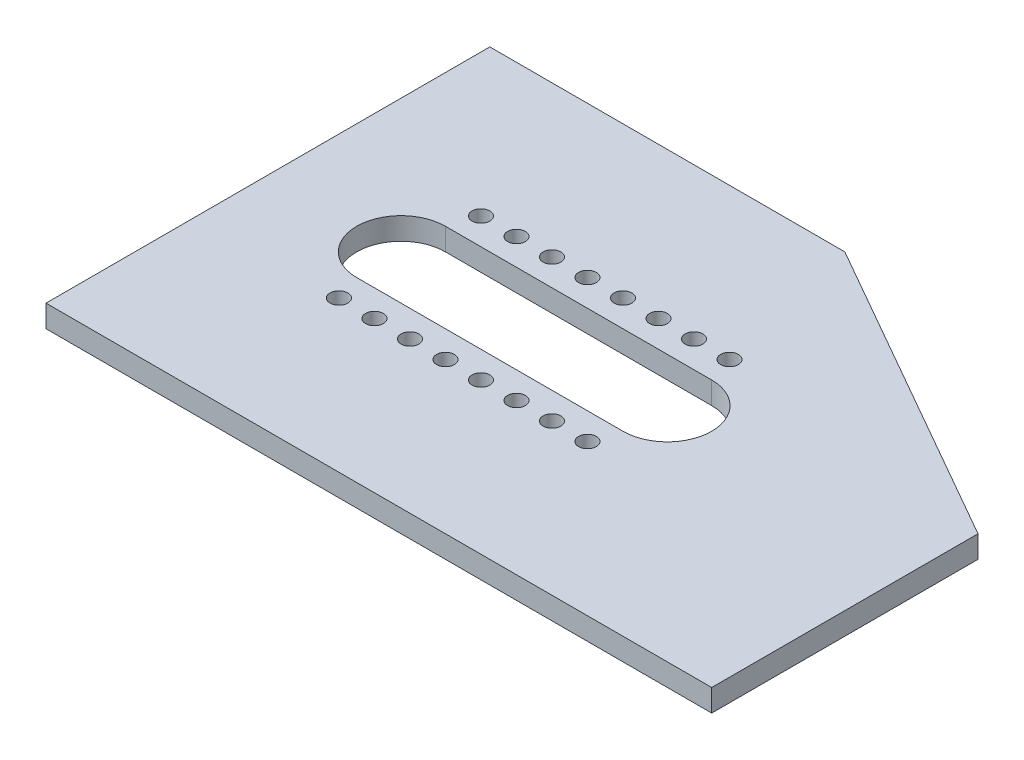
ISO-10303-21;
HEADER;
FILE_DESCRIPTION(('STEP AP214'),'2;1');
FILE_NAME('part.step','',(''),(''),'','','');
FILE_SCHEMA(('AUTOMOTIVE_DESIGN { 1 0 10303 214 1 1 1 1 }'));
ENDSEC;
DATA;
#1=APPLICATION_CONTEXT('core data for automotive mechanical design processes');
#2=APPLICATION_PROTOCOL_DEFINITION('international standard','automotive_design',2000,#1);
#3=PRODUCT_CONTEXT('',#1,'mechanical');
#4=PRODUCT('Part','Part','',(#3));
#5=PRODUCT_RELATED_PRODUCT_CATEGORY('part','',(#4));
#6=PRODUCT_DEFINITION_FORMATION('','',#4);
#7=PRODUCT_DEFINITION_CONTEXT('part definition',#1,'design');
#8=PRODUCT_DEFINITION('design','',#6,#7);
#9=PRODUCT_DEFINITION_SHAPE('','',#8);
#10=(LENGTH_UNIT() NAMED_UNIT(*) SI_UNIT(.MILLI.,.METRE.));
#11=(NAMED_UNIT(*) PLANE_ANGLE_UNIT() SI_UNIT($,.RADIAN.));
#12=(NAMED_UNIT(*) SI_UNIT($,.STERADIAN.) SOLID_ANGLE_UNIT());
#13=UNCERTAINTY_MEASURE_WITH_UNIT(LENGTH_MEASURE(1.E-05),#10,'distance_accuracy_value','');
#14=(GEOMETRIC_REPRESENTATION_CONTEXT(3) GLOBAL_UNCERTAINTY_ASSIGNED_CONTEXT((#13)) GLOBAL_UNIT_ASSIGNED_CONTEXT((#10,
#11,#12)) REPRESENTATION_CONTEXT('',''));
#15=CARTESIAN_POINT('',(0.,0.,0.));
#16=DIRECTION('',(0.,0.,1.));
#17=DIRECTION('',(1.,0.,0.));
#18=AXIS2_PLACEMENT_3D('',#15,#16,#17);
#19=CARTESIAN_POINT('',(0.,5.,100.));
#20=DIRECTION('',(1.,0.,0.));
#21=DIRECTION('',(0.,0.,-1.));
#22=AXIS2_PLACEMENT_3D('',#19,#20,#21);
#23=PLANE('',#22);
#24=DIRECTION('',(0.,0.,1.));
#25=VECTOR('',#24,1.);
#26=CARTESIAN_POINT('',(0.,0.,100.));
#27=LINE('',#26,#25);
#28=CARTESIAN_POINT('',(0.,0.,0.));
#29=VERTEX_POINT('',#28);
#30=CARTESIAN_POINT('',(0.,0.,100.));
#31=VERTEX_POINT('',#30);
#32=EDGE_CURVE('E156',#29,#31,#27,.T.);
#33=ORIENTED_EDGE('',*,*,#32,.T.);
#34=DIRECTION('',(0.,-1.,0.));
#35=VECTOR('',#34,1.);
#36=CARTESIAN_POINT('',(0.,5.,100.));
#37=LINE('',#36,#35);
#38=CARTESIAN_POINT('',(0.,5.,100.));
#39=VERTEX_POINT('',#38);
#40=EDGE_CURVE('E11',#39,#31,#37,.T.);
#41=ORIENTED_EDGE('',*,*,#40,.F.);
#42=DIRECTION('',(0.,0.,1.));
#43=VECTOR('',#42,1.);
#44=CARTESIAN_POINT('',(0.,5.,100.));
#45=LINE('',#44,#43);
#46=CARTESIAN_POINT('',(0.,5.,0.));
#47=VERTEX_POINT('',#46);
#48=EDGE_CURVE('E162',#47,#39,#45,.T.);
#49=ORIENTED_EDGE('',*,*,#48,.F.);
#50=DIRECTION('',(0.,-1.,0.));
#51=VECTOR('',#50,1.);
#52=CARTESIAN_POINT('',(0.,5.,0.));
#53=LINE('',#52,#51);
#54=EDGE_CURVE('E179',#47,#29,#53,.T.);
#55=ORIENTED_EDGE('',*,*,#54,.T.);
#56=EDGE_LOOP('',(#33,#41,#49,#55));
#57=FACE_BOUND('',#56,.T.);
#58=ADVANCED_FACE('F38',(#57),#23,.F.);
#59=CARTESIAN_POINT('',(150.,5.,100.));
#60=DIRECTION('',(0.,0.,-1.));
#61=DIRECTION('',(-1.,0.,0.));
#62=AXIS2_PLACEMENT_3D('',#59,#60,#61);
#63=PLANE('',#62);
#64=DIRECTION('',(1.,0.,0.));
#65=VECTOR('',#64,1.);
#66=CARTESIAN_POINT('',(150.,0.,100.));
#67=LINE('',#66,#65);
#68=CARTESIAN_POINT('',(150.,0.,100.));
#69=VERTEX_POINT('',#68);
#70=EDGE_CURVE('E183',#31,#69,#67,.T.);
#71=ORIENTED_EDGE('',*,*,#70,.T.);
#72=DIRECTION('',(0.,-1.,0.));
#73=VECTOR('',#72,1.);
#74=CARTESIAN_POINT('',(150.,5.,100.));
#75=LINE('',#74,#73);
#76=CARTESIAN_POINT('',(150.,5.,100.));
#77=VERTEX_POINT('',#76);
#78=EDGE_CURVE('E46',#77,#69,#75,.T.);
#79=ORIENTED_EDGE('',*,*,#78,.F.);
#80=DIRECTION('',(1.,0.,0.));
#81=VECTOR('',#80,1.);
#82=CARTESIAN_POINT('',(150.,5.,100.));
#83=LINE('',#82,#81);
#84=EDGE_CURVE('E166',#39,#77,#83,.T.);
#85=ORIENTED_EDGE('',*,*,#84,.F.);
#86=ORIENTED_EDGE('',*,*,#40,.T.);
#87=EDGE_LOOP('',(#71,#79,#85,#86));
#88=FACE_BOUND('',#87,.T.);
#89=ADVANCED_FACE('F228',(#88),#63,.F.);
#90=CARTESIAN_POINT('',(150.,5.,40.));
#91=DIRECTION('',(-1.,0.,0.));
#92=DIRECTION('',(0.,0.,1.));
#93=AXIS2_PLACEMENT_3D('',#90,#91,#92);
#94=PLANE('',#93);
#95=DIRECTION('',(0.,0.,-1.));
#96=VECTOR('',#95,1.);
#97=CARTESIAN_POINT('',(150.,0.,40.));
#98=LINE('',#97,#96);
#99=CARTESIAN_POINT('',(150.,0.,40.));
#100=VERTEX_POINT('',#99);
#101=EDGE_CURVE('E186',#69,#100,#98,.T.);
#102=ORIENTED_EDGE('',*,*,#101,.T.);
#103=DIRECTION('',(0.,-1.,0.));
#104=VECTOR('',#103,1.);
#105=CARTESIAN_POINT('',(150.,5.,40.));
#106=LINE('',#105,#104);
#107=CARTESIAN_POINT('',(150.,5.,40.));
#108=VERTEX_POINT('',#107);
#109=EDGE_CURVE('E201',#108,#100,#106,.T.);
#110=ORIENTED_EDGE('',*,*,#109,.F.);
#111=DIRECTION('',(0.,0.,-1.));
#112=VECTOR('',#111,1.);
#113=CARTESIAN_POINT('',(150.,5.,40.));
#114=LINE('',#113,#112);
#115=EDGE_CURVE('E170',#77,#108,#114,.T.);
#116=ORIENTED_EDGE('',*,*,#115,.F.);
#117=ORIENTED_EDGE('',*,*,#78,.T.);
#118=EDGE_LOOP('',(#102,#110,#116,#117));
#119=FACE_BOUND('',#118,.T.);
#120=ADVANCED_FACE('F210',(#119),#94,.F.);
#121=CARTESIAN_POINT('',(80.,5.,0.));
#122=DIRECTION('',(-0.496138938356834,0.,0.868243142124459));
#123=DIRECTION('',(0.868243142124459,0.,0.496138938356834));
#124=AXIS2_PLACEMENT_3D('',#121,#122,#123);
#125=PLANE('',#124);
#126=DIRECTION('',(-0.868243142124459,0.,-0.496138938356834));
#127=VECTOR('',#126,1.);
#128=CARTESIAN_POINT('',(80.,0.,0.));
#129=LINE('',#128,#127);
#130=CARTESIAN_POINT('',(80.,0.,0.));
#131=VERTEX_POINT('',#130);
#132=EDGE_CURVE('E189',#100,#131,#129,.T.);
#133=ORIENTED_EDGE('',*,*,#132,.T.);
#134=DIRECTION('',(0.,-1.,0.));
#135=VECTOR('',#134,1.);
#136=CARTESIAN_POINT('',(80.,5.,0.));
#137=LINE('',#136,#135);
#138=CARTESIAN_POINT('',(80.,5.,0.));
#139=VERTEX_POINT('',#138);
#140=EDGE_CURVE('E197',#139,#131,#137,.T.);
#141=ORIENTED_EDGE('',*,*,#140,.F.);
#142=DIRECTION('',(-0.868243142124459,0.,-0.496138938356834));
#143=VECTOR('',#142,1.);
#144=CARTESIAN_POINT('',(80.,5.,0.));
#145=LINE('',#144,#143);
#146=EDGE_CURVE('E173',#108,#139,#145,.T.);
#147=ORIENTED_EDGE('',*,*,#146,.F.);
#148=ORIENTED_EDGE('',*,*,#109,.T.);
#149=EDGE_LOOP('',(#133,#141,#147,#148));
#150=FACE_BOUND('',#149,.T.);
#151=ADVANCED_FACE('F218',(#150),#125,.F.);
#152=CARTESIAN_POINT('',(0.,5.,0.));
#153=DIRECTION('',(0.,0.,1.));
#154=DIRECTION('',(1.,0.,0.));
#155=AXIS2_PLACEMENT_3D('',#152,#153,#154);
#156=PLANE('',#155);
#157=DIRECTION('',(-1.,0.,0.));
#158=VECTOR('',#157,1.);
#159=CARTESIAN_POINT('',(0.,0.,0.));
#160=LINE('',#159,#158);
#161=EDGE_CURVE('E167',#131,#29,#160,.T.);
#162=ORIENTED_EDGE('',*,*,#161,.T.);
#163=ORIENTED_EDGE('',*,*,#54,.F.);
#164=DIRECTION('',(-1.,0.,0.));
#165=VECTOR('',#164,1.);
#166=CARTESIAN_POINT('',(0.,5.,0.));
#167=LINE('',#166,#165);
#168=EDGE_CURVE('E176',#139,#47,#167,.T.);
#169=ORIENTED_EDGE('',*,*,#168,.F.);
#170=ORIENTED_EDGE('',*,*,#140,.T.);
#171=EDGE_LOOP('',(#162,#163,#169,#170));
#172=FACE_BOUND('',#171,.T.);
#173=ADVANCED_FACE('F222',(#172),#156,.F.);
#174=CARTESIAN_POINT('',(0.,5.,0.));
#175=DIRECTION('',(0.,-1.,0.));
#176=DIRECTION('',(0.,0.,-1.));
#177=AXIS2_PLACEMENT_3D('',#174,#175,#176);
#178=PLANE('',#177);
#179=CARTESIAN_POINT('',(32.,5.,66.));
#180=DIRECTION('',(0.,1.,0.));
#181=DIRECTION('',(0.,0.,-1.));
#182=AXIS2_PLACEMENT_3D('',#179,#180,#181);
#183=CIRCLE('',#182,2.);
#184=CARTESIAN_POINT('',(32.,5.,64.));
#185=VERTEX_POINT('',#184);
#186=EDGE_CURVE('E137',#185,#185,#183,.T.);
#187=ORIENTED_EDGE('',*,*,#186,.F.);
#188=EDGE_LOOP('',(#187));
#189=FACE_BOUND('',#188,.T.);
#190=CARTESIAN_POINT('',(40.,5.,66.));
#191=DIRECTION('',(0.,1.,0.));
#192=DIRECTION('',(0.,0.,-1.));
#193=AXIS2_PLACEMENT_3D('',#190,#191,#192);
#194=CIRCLE('',#193,2.);
#195=CARTESIAN_POINT('',(40.,5.,64.));
#196=VERTEX_POINT('',#195);
#197=EDGE_CURVE('E445',#196,#196,#194,.T.);
#198=ORIENTED_EDGE('',*,*,#197,.F.);
#199=EDGE_LOOP('',(#198));
#200=FACE_BOUND('',#199,.T.);
#201=CARTESIAN_POINT('',(48.,5.,66.));
#202=DIRECTION('',(0.,1.,0.));
#203=DIRECTION('',(0.,0.,-1.));
#204=AXIS2_PLACEMENT_3D('',#201,#202,#203);
#205=CIRCLE('',#204,2.);
#206=CARTESIAN_POINT('',(48.,5.,64.));
#207=VERTEX_POINT('',#206);
#208=EDGE_CURVE('E437',#207,#207,#205,.T.);
#209=ORIENTED_EDGE('',*,*,#208,.F.);
#210=EDGE_LOOP('',(#209));
#211=FACE_BOUND('',#210,.T.);
#212=CARTESIAN_POINT('',(56.,5.,66.));
#213=DIRECTION('',(0.,1.,0.));
#214=DIRECTION('',(0.,0.,-1.));
#215=AXIS2_PLACEMENT_3D('',#212,#213,#214);
#216=CIRCLE('',#215,2.);
#217=CARTESIAN_POINT('',(56.,5.,64.));
#218=VERTEX_POINT('',#217);
#219=EDGE_CURVE('E429',#218,#218,#216,.T.);
#220=ORIENTED_EDGE('',*,*,#219,.F.);
#221=EDGE_LOOP('',(#220));
#222=FACE_BOUND('',#221,.T.);
#223=CARTESIAN_POINT('',(63.9999999999999,5.,66.));
#224=DIRECTION('',(0.,1.,0.));
#225=DIRECTION('',(0.,0.,-1.));
#226=AXIS2_PLACEMENT_3D('',#223,#224,#225);
#227=CIRCLE('',#226,2.00000000000001);
#228=CARTESIAN_POINT('',(63.9999999999999,5.,64.));
#229=VERTEX_POINT('',#228);
#230=EDGE_CURVE('E421',#229,#229,#227,.T.);
#231=ORIENTED_EDGE('',*,*,#230,.F.);
#232=EDGE_LOOP('',(#231));
#233=FACE_BOUND('',#232,.T.);
#234=CARTESIAN_POINT('',(72.,5.,66.));
#235=DIRECTION('',(0.,1.,0.));
#236=DIRECTION('',(0.,0.,-1.));
#237=AXIS2_PLACEMENT_3D('',#234,#235,#236);
#238=CIRCLE('',#237,2.);
#239=CARTESIAN_POINT('',(72.,5.,64.));
#240=VERTEX_POINT('',#239);
#241=EDGE_CURVE('E413',#240,#240,#238,.T.);
#242=ORIENTED_EDGE('',*,*,#241,.F.);
#243=EDGE_LOOP('',(#242));
#244=FACE_BOUND('',#243,.T.);
#245=CARTESIAN_POINT('',(80.,5.,66.));
#246=DIRECTION('',(0.,1.,0.));
#247=DIRECTION('',(0.,0.,-1.));
#248=AXIS2_PLACEMENT_3D('',#245,#246,#247);
#249=CIRCLE('',#248,2.);
#250=CARTESIAN_POINT('',(80.,5.,64.));
#251=VERTEX_POINT('',#250);
#252=EDGE_CURVE('E405',#251,#251,#249,.T.);
#253=ORIENTED_EDGE('',*,*,#252,.F.);
#254=EDGE_LOOP('',(#253));
#255=FACE_BOUND('',#254,.T.);
#256=CARTESIAN_POINT('',(88.,5.,66.));
#257=DIRECTION('',(0.,1.,0.));
#258=DIRECTION('',(0.,0.,-1.));
#259=AXIS2_PLACEMENT_3D('',#256,#257,#258);
#260=CIRCLE('',#259,2.00000000000001);
#261=CARTESIAN_POINT('',(88.,5.,64.));
#262=VERTEX_POINT('',#261);
#263=EDGE_CURVE('E397',#262,#262,#260,.T.);
#264=ORIENTED_EDGE('',*,*,#263,.F.);
#265=EDGE_LOOP('',(#264));
#266=FACE_BOUND('',#265,.T.);
#267=CARTESIAN_POINT('',(88.,5.,34.));
#268=DIRECTION('',(0.,1.,0.));
#269=DIRECTION('',(0.,0.,1.));
#270=AXIS2_PLACEMENT_3D('',#267,#268,#269);
#271=CIRCLE('',#270,2.00000000000001);
#272=CARTESIAN_POINT('',(88.,5.,36.));
#273=VERTEX_POINT('',#272);
#274=EDGE_CURVE('E389',#273,#273,#271,.T.);
#275=ORIENTED_EDGE('',*,*,#274,.F.);
#276=EDGE_LOOP('',(#275));
#277=FACE_BOUND('',#276,.T.);
#278=CARTESIAN_POINT('',(80.,5.,34.));
#279=DIRECTION('',(0.,1.,0.));
#280=DIRECTION('',(0.,0.,1.));
#281=AXIS2_PLACEMENT_3D('',#278,#279,#280);
#282=CIRCLE('',#281,2.);
#283=CARTESIAN_POINT('',(80.,5.,36.));
#284=VERTEX_POINT('',#283);
#285=EDGE_CURVE('E381',#284,#284,#282,.T.);
#286=ORIENTED_EDGE('',*,*,#285,.F.);
#287=EDGE_LOOP('',(#286));
#288=FACE_BOUND('',#287,.T.);
#289=CARTESIAN_POINT('',(72.,5.,34.));
#290=DIRECTION('',(0.,1.,0.));
#291=DIRECTION('',(0.,0.,1.));
#292=AXIS2_PLACEMENT_3D('',#289,#290,#291);
#293=CIRCLE('',#292,2.);
#294=CARTESIAN_POINT('',(72.,5.,36.));
#295=VERTEX_POINT('',#294);
#296=EDGE_CURVE('E373',#295,#295,#293,.T.);
#297=ORIENTED_EDGE('',*,*,#296,.F.);
#298=EDGE_LOOP('',(#297));
#299=FACE_BOUND('',#298,.T.);
#300=CARTESIAN_POINT('',(64.,5.,34.));
#301=DIRECTION('',(0.,1.,0.));
#302=DIRECTION('',(0.,0.,1.));
#303=AXIS2_PLACEMENT_3D('',#300,#301,#302);
#304=CIRCLE('',#303,2.00000000000001);
#305=CARTESIAN_POINT('',(64.,5.,36.));
#306=VERTEX_POINT('',#305);
#307=EDGE_CURVE('E365',#306,#306,#304,.T.);
#308=ORIENTED_EDGE('',*,*,#307,.F.);
#309=EDGE_LOOP('',(#308));
#310=FACE_BOUND('',#309,.T.);
#311=CARTESIAN_POINT('',(56.,5.,34.));
#312=DIRECTION('',(0.,1.,0.));
#313=DIRECTION('',(0.,0.,1.));
#314=AXIS2_PLACEMENT_3D('',#311,#312,#313);
#315=CIRCLE('',#314,2.);
#316=CARTESIAN_POINT('',(56.,5.,36.));
#317=VERTEX_POINT('',#316);
#318=EDGE_CURVE('E357',#317,#317,#315,.T.);
#319=ORIENTED_EDGE('',*,*,#318,.F.);
#320=EDGE_LOOP('',(#319));
#321=FACE_BOUND('',#320,.T.);
#322=CARTESIAN_POINT('',(48.,5.,34.));
#323=DIRECTION('',(0.,1.,0.));
#324=DIRECTION('',(0.,0.,1.));
#325=AXIS2_PLACEMENT_3D('',#322,#323,#324);
#326=CIRCLE('',#325,2.);
#327=CARTESIAN_POINT('',(48.,5.,36.));
#328=VERTEX_POINT('',#327);
#329=EDGE_CURVE('E349',#328,#328,#326,.T.);
#330=ORIENTED_EDGE('',*,*,#329,.F.);
#331=EDGE_LOOP('',(#330));
#332=FACE_BOUND('',#331,.T.);
#333=CARTESIAN_POINT('',(40.,5.,34.));
#334=DIRECTION('',(0.,1.,0.));
#335=DIRECTION('',(0.,0.,1.));
#336=AXIS2_PLACEMENT_3D('',#333,#334,#335);
#337=CIRCLE('',#336,2.);
#338=CARTESIAN_POINT('',(40.,5.,36.));
#339=VERTEX_POINT('',#338);
#340=EDGE_CURVE('E339',#339,#339,#337,.T.);
#341=ORIENTED_EDGE('',*,*,#340,.F.);
#342=EDGE_LOOP('',(#341));
#343=FACE_BOUND('',#342,.T.);
#344=CARTESIAN_POINT('',(32.,5.,34.));
#345=DIRECTION('',(0.,1.,0.));
#346=DIRECTION('',(0.,0.,1.));
#347=AXIS2_PLACEMENT_3D('',#344,#345,#346);
#348=CIRCLE('',#347,2.);
#349=CARTESIAN_POINT('',(32.,5.,36.));
#350=VERTEX_POINT('',#349);
#351=EDGE_CURVE('E330',#350,#350,#348,.T.);
#352=ORIENTED_EDGE('',*,*,#351,.F.);
#353=EDGE_LOOP('',(#352));
#354=FACE_BOUND('',#353,.T.);
#355=DIRECTION('',(1.,0.,0.));
#356=VECTOR('',#355,1.);
#357=CARTESIAN_POINT('',(30.,5.,60.));
#358=LINE('',#357,#356);
#359=CARTESIAN_POINT('',(30.,5.,60.));
#360=VERTEX_POINT('',#359);
#361=CARTESIAN_POINT('',(90.,5.,60.));
#362=VERTEX_POINT('',#361);
#363=EDGE_CURVE('E146',#360,#362,#358,.T.);
#364=ORIENTED_EDGE('',*,*,#363,.F.);
#365=CARTESIAN_POINT('',(30.,5.,50.));
#366=DIRECTION('',(0.,1.,0.));
#367=DIRECTION('',(0.,0.,1.));
#368=AXIS2_PLACEMENT_3D('',#365,#366,#367);
#369=CIRCLE('',#368,10.);
#370=CARTESIAN_POINT('',(30.,5.,40.));
#371=VERTEX_POINT('',#370);
#372=EDGE_CURVE('E53',#371,#360,#369,.T.);
#373=ORIENTED_EDGE('',*,*,#372,.F.);
#374=DIRECTION('',(-1.,0.,0.));
#375=VECTOR('',#374,1.);
#376=CARTESIAN_POINT('',(30.,5.,40.));
#377=LINE('',#376,#375);
#378=CARTESIAN_POINT('',(90.,5.,40.));
#379=VERTEX_POINT('',#378);
#380=EDGE_CURVE('E130',#379,#371,#377,.T.);
#381=ORIENTED_EDGE('',*,*,#380,.F.);
#382=CARTESIAN_POINT('',(90.,5.,50.));
#383=DIRECTION('',(0.,1.,0.));
#384=DIRECTION('',(0.,0.,1.));
#385=AXIS2_PLACEMENT_3D('',#382,#383,#384);
#386=CIRCLE('',#385,10.);
#387=EDGE_CURVE('E134',#362,#379,#386,.T.);
#388=ORIENTED_EDGE('',*,*,#387,.F.);
#389=EDGE_LOOP('',(#364,#373,#381,#388));
#390=FACE_BOUND('',#389,.T.);
#391=ORIENTED_EDGE('',*,*,#48,.T.);
#392=ORIENTED_EDGE('',*,*,#84,.T.);
#393=ORIENTED_EDGE('',*,*,#115,.T.);
#394=ORIENTED_EDGE('',*,*,#146,.T.);
#395=ORIENTED_EDGE('',*,*,#168,.T.);
#396=EDGE_LOOP('',(#391,#392,#393,#394,#395));
#397=FACE_BOUND('',#396,.T.);
#398=ADVANCED_FACE('F226',(#189,#200,#211,#222,#233,#244,#255,#266,#277,#288,#299,#310,#321,
#332,#343,#354,#390,#397),#178,.F.);
#399=CARTESIAN_POINT('',(0.,0.,0.));
#400=DIRECTION('',(0.,-1.,0.));
#401=DIRECTION('',(0.,0.,-1.));
#402=AXIS2_PLACEMENT_3D('',#399,#400,#401);
#403=PLANE('',#402);
#404=CARTESIAN_POINT('',(32.,0.,66.));
#405=DIRECTION('',(0.,1.,0.));
#406=DIRECTION('',(0.,0.,-1.));
#407=AXIS2_PLACEMENT_3D('',#404,#405,#406);
#408=CIRCLE('',#407,2.);
#409=CARTESIAN_POINT('',(32.,0.,64.));
#410=VERTEX_POINT('',#409);
#411=EDGE_CURVE('E448',#410,#410,#408,.T.);
#412=ORIENTED_EDGE('',*,*,#411,.T.);
#413=EDGE_LOOP('',(#412));
#414=FACE_BOUND('',#413,.T.);
#415=CARTESIAN_POINT('',(40.,0.,66.));
#416=DIRECTION('',(0.,1.,0.));
#417=DIRECTION('',(0.,0.,-1.));
#418=AXIS2_PLACEMENT_3D('',#415,#416,#417);
#419=CIRCLE('',#418,2.);
#420=CARTESIAN_POINT('',(40.,0.,64.));
#421=VERTEX_POINT('',#420);
#422=EDGE_CURVE('E441',#421,#421,#419,.T.);
#423=ORIENTED_EDGE('',*,*,#422,.T.);
#424=EDGE_LOOP('',(#423));
#425=FACE_BOUND('',#424,.T.);
#426=CARTESIAN_POINT('',(48.,0.,66.));
#427=DIRECTION('',(0.,1.,0.));
#428=DIRECTION('',(0.,0.,-1.));
#429=AXIS2_PLACEMENT_3D('',#426,#427,#428);
#430=CIRCLE('',#429,2.);
#431=CARTESIAN_POINT('',(48.,0.,64.));
#432=VERTEX_POINT('',#431);
#433=EDGE_CURVE('E433',#432,#432,#430,.T.);
#434=ORIENTED_EDGE('',*,*,#433,.T.);
#435=EDGE_LOOP('',(#434));
#436=FACE_BOUND('',#435,.T.);
#437=CARTESIAN_POINT('',(56.,0.,66.));
#438=DIRECTION('',(0.,1.,0.));
#439=DIRECTION('',(0.,0.,-1.));
#440=AXIS2_PLACEMENT_3D('',#437,#438,#439);
#441=CIRCLE('',#440,2.);
#442=CARTESIAN_POINT('',(56.,0.,64.));
#443=VERTEX_POINT('',#442);
#444=EDGE_CURVE('E425',#443,#443,#441,.T.);
#445=ORIENTED_EDGE('',*,*,#444,.T.);
#446=EDGE_LOOP('',(#445));
#447=FACE_BOUND('',#446,.T.);
#448=CARTESIAN_POINT('',(63.9999999999999,0.,66.));
#449=DIRECTION('',(0.,1.,0.));
#450=DIRECTION('',(0.,0.,-1.));
#451=AXIS2_PLACEMENT_3D('',#448,#449,#450);
#452=CIRCLE('',#451,2.00000000000001);
#453=CARTESIAN_POINT('',(63.9999999999999,0.,64.));
#454=VERTEX_POINT('',#453);
#455=EDGE_CURVE('E417',#454,#454,#452,.T.);
#456=ORIENTED_EDGE('',*,*,#455,.T.);
#457=EDGE_LOOP('',(#456));
#458=FACE_BOUND('',#457,.T.);
#459=CARTESIAN_POINT('',(72.,0.,66.));
#460=DIRECTION('',(0.,1.,0.));
#461=DIRECTION('',(0.,0.,-1.));
#462=AXIS2_PLACEMENT_3D('',#459,#460,#461);
#463=CIRCLE('',#462,2.);
#464=CARTESIAN_POINT('',(72.,0.,64.));
#465=VERTEX_POINT('',#464);
#466=EDGE_CURVE('E409',#465,#465,#463,.T.);
#467=ORIENTED_EDGE('',*,*,#466,.T.);
#468=EDGE_LOOP('',(#467));
#469=FACE_BOUND('',#468,.T.);
#470=CARTESIAN_POINT('',(80.,0.,66.));
#471=DIRECTION('',(0.,1.,0.));
#472=DIRECTION('',(0.,0.,-1.));
#473=AXIS2_PLACEMENT_3D('',#470,#471,#472);
#474=CIRCLE('',#473,2.);
#475=CARTESIAN_POINT('',(80.,0.,64.));
#476=VERTEX_POINT('',#475);
#477=EDGE_CURVE('E401',#476,#476,#474,.T.);
#478=ORIENTED_EDGE('',*,*,#477,.T.);
#479=EDGE_LOOP('',(#478));
#480=FACE_BOUND('',#479,.T.);
#481=CARTESIAN_POINT('',(88.,0.,66.));
#482=DIRECTION('',(0.,1.,0.));
#483=DIRECTION('',(0.,0.,-1.));
#484=AXIS2_PLACEMENT_3D('',#481,#482,#483);
#485=CIRCLE('',#484,2.00000000000001);
#486=CARTESIAN_POINT('',(88.,0.,64.));
#487=VERTEX_POINT('',#486);
#488=EDGE_CURVE('E393',#487,#487,#485,.T.);
#489=ORIENTED_EDGE('',*,*,#488,.T.);
#490=EDGE_LOOP('',(#489));
#491=FACE_BOUND('',#490,.T.);
#492=CARTESIAN_POINT('',(88.,0.,34.));
#493=DIRECTION('',(0.,1.,0.));
#494=DIRECTION('',(0.,0.,1.));
#495=AXIS2_PLACEMENT_3D('',#492,#493,#494);
#496=CIRCLE('',#495,2.00000000000001);
#497=CARTESIAN_POINT('',(88.,0.,36.));
#498=VERTEX_POINT('',#497);
#499=EDGE_CURVE('E385',#498,#498,#496,.T.);
#500=ORIENTED_EDGE('',*,*,#499,.T.);
#501=EDGE_LOOP('',(#500));
#502=FACE_BOUND('',#501,.T.);
#503=CARTESIAN_POINT('',(80.,0.,34.));
#504=DIRECTION('',(0.,1.,0.));
#505=DIRECTION('',(0.,0.,1.));
#506=AXIS2_PLACEMENT_3D('',#503,#504,#505);
#507=CIRCLE('',#506,2.);
#508=CARTESIAN_POINT('',(80.,0.,36.));
#509=VERTEX_POINT('',#508);
#510=EDGE_CURVE('E377',#509,#509,#507,.T.);
#511=ORIENTED_EDGE('',*,*,#510,.T.);
#512=EDGE_LOOP('',(#511));
#513=FACE_BOUND('',#512,.T.);
#514=CARTESIAN_POINT('',(72.,0.,34.));
#515=DIRECTION('',(0.,1.,0.));
#516=DIRECTION('',(0.,0.,1.));
#517=AXIS2_PLACEMENT_3D('',#514,#515,#516);
#518=CIRCLE('',#517,2.);
#519=CARTESIAN_POINT('',(72.,0.,36.));
#520=VERTEX_POINT('',#519);
#521=EDGE_CURVE('E369',#520,#520,#518,.T.);
#522=ORIENTED_EDGE('',*,*,#521,.T.);
#523=EDGE_LOOP('',(#522));
#524=FACE_BOUND('',#523,.T.);
#525=CARTESIAN_POINT('',(64.,0.,34.));
#526=DIRECTION('',(0.,1.,0.));
#527=DIRECTION('',(0.,0.,1.));
#528=AXIS2_PLACEMENT_3D('',#525,#526,#527);
#529=CIRCLE('',#528,2.00000000000001);
#530=CARTESIAN_POINT('',(64.,0.,36.));
#531=VERTEX_POINT('',#530);
#532=EDGE_CURVE('E361',#531,#531,#529,.T.);
#533=ORIENTED_EDGE('',*,*,#532,.T.);
#534=EDGE_LOOP('',(#533));
#535=FACE_BOUND('',#534,.T.);
#536=CARTESIAN_POINT('',(56.,0.,34.));
#537=DIRECTION('',(0.,1.,0.));
#538=DIRECTION('',(0.,0.,1.));
#539=AXIS2_PLACEMENT_3D('',#536,#537,#538);
#540=CIRCLE('',#539,2.);
#541=CARTESIAN_POINT('',(56.,0.,36.));
#542=VERTEX_POINT('',#541);
#543=EDGE_CURVE('E353',#542,#542,#540,.T.);
#544=ORIENTED_EDGE('',*,*,#543,.T.);
#545=EDGE_LOOP('',(#544));
#546=FACE_BOUND('',#545,.T.);
#547=CARTESIAN_POINT('',(48.,0.,34.));
#548=DIRECTION('',(0.,1.,0.));
#549=DIRECTION('',(0.,0.,1.));
#550=AXIS2_PLACEMENT_3D('',#547,#548,#549);
#551=CIRCLE('',#550,2.);
#552=CARTESIAN_POINT('',(48.,0.,36.));
#553=VERTEX_POINT('',#552);
#554=EDGE_CURVE('E345',#553,#553,#551,.T.);
#555=ORIENTED_EDGE('',*,*,#554,.T.);
#556=EDGE_LOOP('',(#555));
#557=FACE_BOUND('',#556,.T.);
#558=CARTESIAN_POINT('',(40.,0.,34.));
#559=DIRECTION('',(0.,1.,0.));
#560=DIRECTION('',(0.,0.,1.));
#561=AXIS2_PLACEMENT_3D('',#558,#559,#560);
#562=CIRCLE('',#561,2.);
#563=CARTESIAN_POINT('',(40.,0.,36.));
#564=VERTEX_POINT('',#563);
#565=EDGE_CURVE('E333',#564,#564,#562,.T.);
#566=ORIENTED_EDGE('',*,*,#565,.T.);
#567=EDGE_LOOP('',(#566));
#568=FACE_BOUND('',#567,.T.);
#569=CARTESIAN_POINT('',(32.,0.,34.));
#570=DIRECTION('',(0.,1.,0.));
#571=DIRECTION('',(0.,0.,1.));
#572=AXIS2_PLACEMENT_3D('',#569,#570,#571);
#573=CIRCLE('',#572,2.);
#574=CARTESIAN_POINT('',(32.,0.,36.));
#575=VERTEX_POINT('',#574);
#576=EDGE_CURVE('E147',#575,#575,#573,.T.);
#577=ORIENTED_EDGE('',*,*,#576,.T.);
#578=EDGE_LOOP('',(#577));
#579=FACE_BOUND('',#578,.T.);
#580=CARTESIAN_POINT('',(30.,0.,50.));
#581=DIRECTION('',(0.,1.,0.));
#582=DIRECTION('',(0.,0.,1.));
#583=AXIS2_PLACEMENT_3D('',#580,#581,#582);
#584=CIRCLE('',#583,10.);
#585=CARTESIAN_POINT('',(30.,0.,40.));
#586=VERTEX_POINT('',#585);
#587=CARTESIAN_POINT('',(30.,0.,60.));
#588=VERTEX_POINT('',#587);
#589=EDGE_CURVE('E111',#586,#588,#584,.T.);
#590=ORIENTED_EDGE('',*,*,#589,.T.);
#591=DIRECTION('',(1.,0.,0.));
#592=VECTOR('',#591,1.);
#593=CARTESIAN_POINT('',(30.,0.,60.));
#594=LINE('',#593,#592);
#595=CARTESIAN_POINT('',(90.,0.,60.));
#596=VERTEX_POINT('',#595);
#597=EDGE_CURVE('E121',#588,#596,#594,.T.);
#598=ORIENTED_EDGE('',*,*,#597,.T.);
#599=CARTESIAN_POINT('',(90.,0.,50.));
#600=DIRECTION('',(0.,1.,0.));
#601=DIRECTION('',(0.,0.,1.));
#602=AXIS2_PLACEMENT_3D('',#599,#600,#601);
#603=CIRCLE('',#602,10.);
#604=CARTESIAN_POINT('',(90.,0.,40.));
#605=VERTEX_POINT('',#604);
#606=EDGE_CURVE('E61',#596,#605,#603,.T.);
#607=ORIENTED_EDGE('',*,*,#606,.T.);
#608=DIRECTION('',(-1.,0.,0.));
#609=VECTOR('',#608,1.);
#610=CARTESIAN_POINT('',(30.,0.,40.));
#611=LINE('',#610,#609);
#612=EDGE_CURVE('E118',#605,#586,#611,.T.);
#613=ORIENTED_EDGE('',*,*,#612,.T.);
#614=EDGE_LOOP('',(#590,#598,#607,#613));
#615=FACE_BOUND('',#614,.T.);
#616=ORIENTED_EDGE('',*,*,#32,.F.);
#617=ORIENTED_EDGE('',*,*,#161,.F.);
#618=ORIENTED_EDGE('',*,*,#132,.F.);
#619=ORIENTED_EDGE('',*,*,#101,.F.);
#620=ORIENTED_EDGE('',*,*,#70,.F.);
#621=EDGE_LOOP('',(#616,#617,#618,#619,#620));
#622=FACE_BOUND('',#621,.T.);
#623=ADVANCED_FACE('F126',(#414,#425,#436,#447,#458,#469,#480,#491,#502,#513,#524,#535,#546,
#557,#568,#579,#615,#622),#403,.T.);
#624=CARTESIAN_POINT('',(30.,0.,50.));
#625=DIRECTION('',(0.,1.,0.));
#626=DIRECTION('',(0.,0.,1.));
#627=AXIS2_PLACEMENT_3D('',#624,#625,#626);
#628=CYLINDRICAL_SURFACE('',#627,10.);
#629=ORIENTED_EDGE('',*,*,#372,.T.);
#630=DIRECTION('',(0.,1.,0.));
#631=VECTOR('',#630,1.);
#632=CARTESIAN_POINT('',(30.,0.,60.));
#633=LINE('',#632,#631);
#634=EDGE_CURVE('E107',#588,#360,#633,.T.);
#635=ORIENTED_EDGE('',*,*,#634,.F.);
#636=ORIENTED_EDGE('',*,*,#589,.F.);
#637=DIRECTION('',(0.,1.,0.));
#638=VECTOR('',#637,1.);
#639=CARTESIAN_POINT('',(30.,0.,40.));
#640=LINE('',#639,#638);
#641=EDGE_CURVE('E153',#586,#371,#640,.T.);
#642=ORIENTED_EDGE('',*,*,#641,.T.);
#643=EDGE_LOOP('',(#629,#635,#636,#642));
#644=FACE_BOUND('',#643,.T.);
#645=ADVANCED_FACE('F109',(#644),#628,.F.);
#646=CARTESIAN_POINT('',(30.,0.,40.));
#647=DIRECTION('',(0.,0.,-1.));
#648=DIRECTION('',(-1.,0.,0.));
#649=AXIS2_PLACEMENT_3D('',#646,#647,#648);
#650=PLANE('',#649);
#651=ORIENTED_EDGE('',*,*,#380,.T.);
#652=ORIENTED_EDGE('',*,*,#641,.F.);
#653=ORIENTED_EDGE('',*,*,#612,.F.);
#654=DIRECTION('',(0.,1.,0.));
#655=VECTOR('',#654,1.);
#656=CARTESIAN_POINT('',(90.,0.,40.));
#657=LINE('',#656,#655);
#658=EDGE_CURVE('E157',#605,#379,#657,.T.);
#659=ORIENTED_EDGE('',*,*,#658,.T.);
#660=EDGE_LOOP('',(#651,#652,#653,#659));
#661=FACE_BOUND('',#660,.T.);
#662=ADVANCED_FACE('F251',(#661),#650,.F.);
#663=CARTESIAN_POINT('',(90.,0.,50.));
#664=DIRECTION('',(0.,1.,0.));
#665=DIRECTION('',(0.,0.,1.));
#666=AXIS2_PLACEMENT_3D('',#663,#664,#665);
#667=CYLINDRICAL_SURFACE('',#666,10.);
#668=ORIENTED_EDGE('',*,*,#387,.T.);
#669=ORIENTED_EDGE('',*,*,#658,.F.);
#670=ORIENTED_EDGE('',*,*,#606,.F.);
#671=DIRECTION('',(0.,1.,0.));
#672=VECTOR('',#671,1.);
#673=CARTESIAN_POINT('',(90.,0.,60.));
#674=LINE('',#673,#672);
#675=EDGE_CURVE('E117',#596,#362,#674,.T.);
#676=ORIENTED_EDGE('',*,*,#675,.T.);
#677=EDGE_LOOP('',(#668,#669,#670,#676));
#678=FACE_BOUND('',#677,.T.);
#679=ADVANCED_FACE('F255',(#678),#667,.F.);
#680=CARTESIAN_POINT('',(30.,0.,60.));
#681=DIRECTION('',(0.,0.,1.));
#682=DIRECTION('',(1.,0.,0.));
#683=AXIS2_PLACEMENT_3D('',#680,#681,#682);
#684=PLANE('',#683);
#685=ORIENTED_EDGE('',*,*,#363,.T.);
#686=ORIENTED_EDGE('',*,*,#675,.F.);
#687=ORIENTED_EDGE('',*,*,#597,.F.);
#688=ORIENTED_EDGE('',*,*,#634,.T.);
#689=EDGE_LOOP('',(#685,#686,#687,#688));
#690=FACE_BOUND('',#689,.T.);
#691=ADVANCED_FACE('F122',(#690),#684,.F.);
#692=CARTESIAN_POINT('',(32.,0.,34.));
#693=DIRECTION('',(0.,1.,0.));
#694=DIRECTION('',(0.,0.,1.));
#695=AXIS2_PLACEMENT_3D('',#692,#693,#694);
#696=CYLINDRICAL_SURFACE('',#695,2.);
#697=ORIENTED_EDGE('',*,*,#576,.F.);
#698=EDGE_LOOP('',(#697));
#699=FACE_BOUND('',#698,.T.);
#700=ORIENTED_EDGE('',*,*,#351,.T.);
#701=EDGE_LOOP('',(#700));
#702=FACE_BOUND('',#701,.T.);
#703=ADVANCED_FACE('F254',(#699,#702),#696,.F.);
#704=CARTESIAN_POINT('',(40.,0.,34.));
#705=DIRECTION('',(0.,1.,0.));
#706=DIRECTION('',(0.,0.,1.));
#707=AXIS2_PLACEMENT_3D('',#704,#705,#706);
#708=CYLINDRICAL_SURFACE('',#707,2.);
#709=ORIENTED_EDGE('',*,*,#565,.F.);
#710=EDGE_LOOP('',(#709));
#711=FACE_BOUND('',#710,.T.);
#712=ORIENTED_EDGE('',*,*,#340,.T.);
#713=EDGE_LOOP('',(#712));
#714=FACE_BOUND('',#713,.T.);
#715=ADVANCED_FACE('F316',(#711,#714),#708,.F.);
#716=CARTESIAN_POINT('',(48.,0.,34.));
#717=DIRECTION('',(0.,1.,0.));
#718=DIRECTION('',(0.,0.,1.));
#719=AXIS2_PLACEMENT_3D('',#716,#717,#718);
#720=CYLINDRICAL_SURFACE('',#719,2.);
#721=ORIENTED_EDGE('',*,*,#554,.F.);
#722=EDGE_LOOP('',(#721));
#723=FACE_BOUND('',#722,.T.);
#724=ORIENTED_EDGE('',*,*,#329,.T.);
#725=EDGE_LOOP('',(#724));
#726=FACE_BOUND('',#725,.T.);
#727=ADVANCED_FACE('F312',(#723,#726),#720,.F.);
#728=CARTESIAN_POINT('',(56.,0.,34.));
#729=DIRECTION('',(0.,1.,0.));
#730=DIRECTION('',(0.,0.,1.));
#731=AXIS2_PLACEMENT_3D('',#728,#729,#730);
#732=CYLINDRICAL_SURFACE('',#731,2.);
#733=ORIENTED_EDGE('',*,*,#543,.F.);
#734=EDGE_LOOP('',(#733));
#735=FACE_BOUND('',#734,.T.);
#736=ORIENTED_EDGE('',*,*,#318,.T.);
#737=EDGE_LOOP('',(#736));
#738=FACE_BOUND('',#737,.T.);
#739=ADVANCED_FACE('F308',(#735,#738),#732,.F.);
#740=CARTESIAN_POINT('',(64.,0.,34.));
#741=DIRECTION('',(0.,1.,0.));
#742=DIRECTION('',(0.,0.,1.));
#743=AXIS2_PLACEMENT_3D('',#740,#741,#742);
#744=CYLINDRICAL_SURFACE('',#743,2.00000000000001);
#745=ORIENTED_EDGE('',*,*,#532,.F.);
#746=EDGE_LOOP('',(#745));
#747=FACE_BOUND('',#746,.T.);
#748=ORIENTED_EDGE('',*,*,#307,.T.);
#749=EDGE_LOOP('',(#748));
#750=FACE_BOUND('',#749,.T.);
#751=ADVANCED_FACE('F304',(#747,#750),#744,.F.);
#752=CARTESIAN_POINT('',(72.,0.,34.));
#753=DIRECTION('',(0.,1.,0.));
#754=DIRECTION('',(0.,0.,1.));
#755=AXIS2_PLACEMENT_3D('',#752,#753,#754);
#756=CYLINDRICAL_SURFACE('',#755,2.);
#757=ORIENTED_EDGE('',*,*,#521,.F.);
#758=EDGE_LOOP('',(#757));
#759=FACE_BOUND('',#758,.T.);
#760=ORIENTED_EDGE('',*,*,#296,.T.);
#761=EDGE_LOOP('',(#760));
#762=FACE_BOUND('',#761,.T.);
#763=ADVANCED_FACE('F300',(#759,#762),#756,.F.);
#764=CARTESIAN_POINT('',(80.,0.,34.));
#765=DIRECTION('',(0.,1.,0.));
#766=DIRECTION('',(0.,0.,1.));
#767=AXIS2_PLACEMENT_3D('',#764,#765,#766);
#768=CYLINDRICAL_SURFACE('',#767,2.);
#769=ORIENTED_EDGE('',*,*,#510,.F.);
#770=EDGE_LOOP('',(#769));
#771=FACE_BOUND('',#770,.T.);
#772=ORIENTED_EDGE('',*,*,#285,.T.);
#773=EDGE_LOOP('',(#772));
#774=FACE_BOUND('',#773,.T.);
#775=ADVANCED_FACE('F296',(#771,#774),#768,.F.);
#776=CARTESIAN_POINT('',(88.,0.,34.));
#777=DIRECTION('',(0.,1.,0.));
#778=DIRECTION('',(0.,0.,1.));
#779=AXIS2_PLACEMENT_3D('',#776,#777,#778);
#780=CYLINDRICAL_SURFACE('',#779,2.00000000000001);
#781=ORIENTED_EDGE('',*,*,#499,.F.);
#782=EDGE_LOOP('',(#781));
#783=FACE_BOUND('',#782,.T.);
#784=ORIENTED_EDGE('',*,*,#274,.T.);
#785=EDGE_LOOP('',(#784));
#786=FACE_BOUND('',#785,.T.);
#787=ADVANCED_FACE('F292',(#783,#786),#780,.F.);
#788=CARTESIAN_POINT('',(88.,0.,66.));
#789=DIRECTION('',(0.,1.,0.));
#790=DIRECTION('',(0.,0.,1.));
#791=AXIS2_PLACEMENT_3D('',#788,#789,#790);
#792=CYLINDRICAL_SURFACE('',#791,2.00000000000001);
#793=ORIENTED_EDGE('',*,*,#488,.F.);
#794=EDGE_LOOP('',(#793));
#795=FACE_BOUND('',#794,.T.);
#796=ORIENTED_EDGE('',*,*,#263,.T.);
#797=EDGE_LOOP('',(#796));
#798=FACE_BOUND('',#797,.T.);
#799=ADVANCED_FACE('F288',(#795,#798),#792,.F.);
#800=CARTESIAN_POINT('',(80.,0.,66.));
#801=DIRECTION('',(0.,1.,0.));
#802=DIRECTION('',(0.,0.,1.));
#803=AXIS2_PLACEMENT_3D('',#800,#801,#802);
#804=CYLINDRICAL_SURFACE('',#803,2.);
#805=ORIENTED_EDGE('',*,*,#477,.F.);
#806=EDGE_LOOP('',(#805));
#807=FACE_BOUND('',#806,.T.);
#808=ORIENTED_EDGE('',*,*,#252,.T.);
#809=EDGE_LOOP('',(#808));
#810=FACE_BOUND('',#809,.T.);
#811=ADVANCED_FACE('F284',(#807,#810),#804,.F.);
#812=CARTESIAN_POINT('',(72.,0.,66.));
#813=DIRECTION('',(0.,1.,0.));
#814=DIRECTION('',(0.,0.,1.));
#815=AXIS2_PLACEMENT_3D('',#812,#813,#814);
#816=CYLINDRICAL_SURFACE('',#815,2.);
#817=ORIENTED_EDGE('',*,*,#466,.F.);
#818=EDGE_LOOP('',(#817));
#819=FACE_BOUND('',#818,.T.);
#820=ORIENTED_EDGE('',*,*,#241,.T.);
#821=EDGE_LOOP('',(#820));
#822=FACE_BOUND('',#821,.T.);
#823=ADVANCED_FACE('F280',(#819,#822),#816,.F.);
#824=CARTESIAN_POINT('',(63.9999999999999,0.,66.));
#825=DIRECTION('',(0.,1.,0.));
#826=DIRECTION('',(0.,0.,1.));
#827=AXIS2_PLACEMENT_3D('',#824,#825,#826);
#828=CYLINDRICAL_SURFACE('',#827,2.00000000000001);
#829=ORIENTED_EDGE('',*,*,#455,.F.);
#830=EDGE_LOOP('',(#829));
#831=FACE_BOUND('',#830,.T.);
#832=ORIENTED_EDGE('',*,*,#230,.T.);
#833=EDGE_LOOP('',(#832));
#834=FACE_BOUND('',#833,.T.);
#835=ADVANCED_FACE('F276',(#831,#834),#828,.F.);
#836=CARTESIAN_POINT('',(56.,0.,66.));
#837=DIRECTION('',(0.,1.,0.));
#838=DIRECTION('',(0.,0.,1.));
#839=AXIS2_PLACEMENT_3D('',#836,#837,#838);
#840=CYLINDRICAL_SURFACE('',#839,2.);
#841=ORIENTED_EDGE('',*,*,#444,.F.);
#842=EDGE_LOOP('',(#841));
#843=FACE_BOUND('',#842,.T.);
#844=ORIENTED_EDGE('',*,*,#219,.T.);
#845=EDGE_LOOP('',(#844));
#846=FACE_BOUND('',#845,.T.);
#847=ADVANCED_FACE('F272',(#843,#846),#840,.F.);
#848=CARTESIAN_POINT('',(48.,0.,66.));
#849=DIRECTION('',(0.,1.,0.));
#850=DIRECTION('',(0.,0.,1.));
#851=AXIS2_PLACEMENT_3D('',#848,#849,#850);
#852=CYLINDRICAL_SURFACE('',#851,2.);
#853=ORIENTED_EDGE('',*,*,#433,.F.);
#854=EDGE_LOOP('',(#853));
#855=FACE_BOUND('',#854,.T.);
#856=ORIENTED_EDGE('',*,*,#208,.T.);
#857=EDGE_LOOP('',(#856));
#858=FACE_BOUND('',#857,.T.);
#859=ADVANCED_FACE('F268',(#855,#858),#852,.F.);
#860=CARTESIAN_POINT('',(40.,0.,66.));
#861=DIRECTION('',(0.,1.,0.));
#862=DIRECTION('',(0.,0.,1.));
#863=AXIS2_PLACEMENT_3D('',#860,#861,#862);
#864=CYLINDRICAL_SURFACE('',#863,2.);
#865=ORIENTED_EDGE('',*,*,#422,.F.);
#866=EDGE_LOOP('',(#865));
#867=FACE_BOUND('',#866,.T.);
#868=ORIENTED_EDGE('',*,*,#197,.T.);
#869=EDGE_LOOP('',(#868));
#870=FACE_BOUND('',#869,.T.);
#871=ADVANCED_FACE('F264',(#867,#870),#864,.F.);
#872=CARTESIAN_POINT('',(32.,0.,66.));
#873=DIRECTION('',(0.,1.,0.));
#874=DIRECTION('',(0.,0.,1.));
#875=AXIS2_PLACEMENT_3D('',#872,#873,#874);
#876=CYLINDRICAL_SURFACE('',#875,2.);
#877=ORIENTED_EDGE('',*,*,#411,.F.);
#878=EDGE_LOOP('',(#877));
#879=FACE_BOUND('',#878,.T.);
#880=ORIENTED_EDGE('',*,*,#186,.T.);
#881=EDGE_LOOP('',(#880));
#882=FACE_BOUND('',#881,.T.);
#883=ADVANCED_FACE('F261',(#879,#882),#876,.F.);
#884=CLOSED_SHELL('',(#58,#89,#120,#151,#173,#398,#623,#645,#662,#679,#691,#703,#715,#727,#739,
#751,#763,#775,#787,#799,#811,#823,#835,#847,#859,#871,#883));
#885=MANIFOLD_SOLID_BREP('B2',#884);
#886=ADVANCED_BREP_SHAPE_REPRESENTATION('',(#18,#885),#14);
#887=SHAPE_DEFINITION_REPRESENTATION(#9,#886);
ENDSEC;
END-ISO-10303-21;
